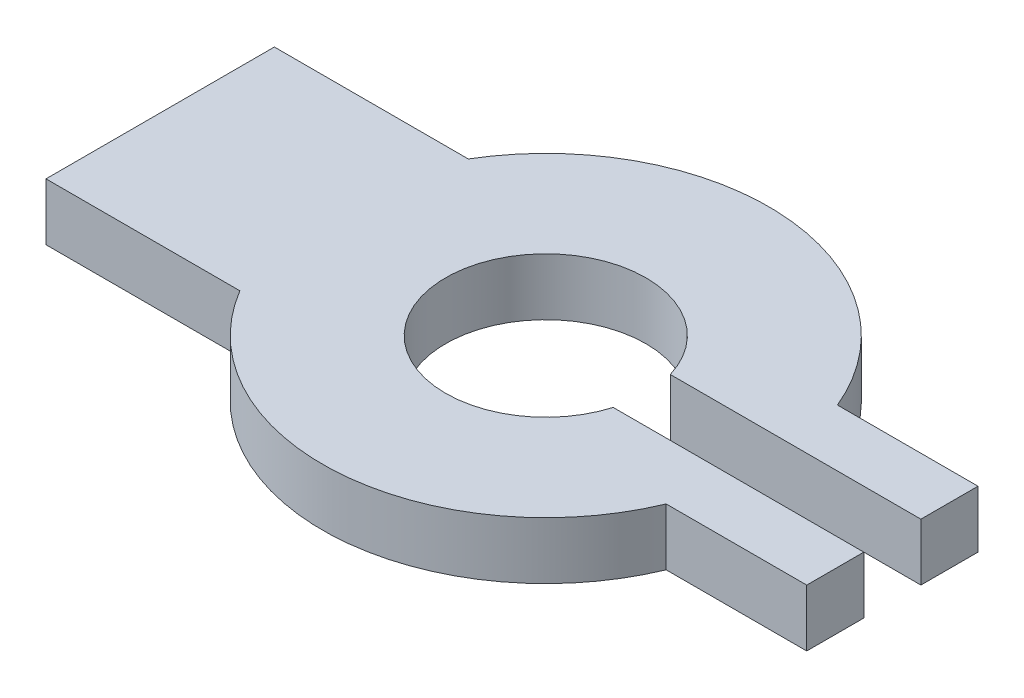
ISO-10303-21;
HEADER;
FILE_DESCRIPTION(('STEP AP214'),'2;1');
FILE_NAME('part.step','',(''),(''),'','','');
FILE_SCHEMA(('AUTOMOTIVE_DESIGN { 1 0 10303 214 1 1 1 1 }'));
ENDSEC;
DATA;
#1=APPLICATION_CONTEXT('core data for automotive mechanical design processes');
#2=APPLICATION_PROTOCOL_DEFINITION('international standard','automotive_design',2000,#1);
#3=PRODUCT_CONTEXT('',#1,'mechanical');
#4=PRODUCT('Part','Part','',(#3));
#5=PRODUCT_RELATED_PRODUCT_CATEGORY('part','',(#4));
#6=PRODUCT_DEFINITION_FORMATION('','',#4);
#7=PRODUCT_DEFINITION_CONTEXT('part definition',#1,'design');
#8=PRODUCT_DEFINITION('design','',#6,#7);
#9=PRODUCT_DEFINITION_SHAPE('','',#8);
#10=(LENGTH_UNIT() NAMED_UNIT(*) SI_UNIT(.MILLI.,.METRE.));
#11=(NAMED_UNIT(*) PLANE_ANGLE_UNIT() SI_UNIT($,.RADIAN.));
#12=(NAMED_UNIT(*) SI_UNIT($,.STERADIAN.) SOLID_ANGLE_UNIT());
#13=UNCERTAINTY_MEASURE_WITH_UNIT(LENGTH_MEASURE(1.E-05),#10,'distance_accuracy_value','');
#14=(GEOMETRIC_REPRESENTATION_CONTEXT(3) GLOBAL_UNCERTAINTY_ASSIGNED_CONTEXT((#13)) GLOBAL_UNIT_ASSIGNED_CONTEXT((#10,
#11,#12)) REPRESENTATION_CONTEXT('',''));
#15=CARTESIAN_POINT('',(0.,0.,0.));
#16=DIRECTION('',(0.,0.,1.));
#17=DIRECTION('',(1.,0.,0.));
#18=AXIS2_PLACEMENT_3D('',#15,#16,#17);
#19=CARTESIAN_POINT('',(3.39995645364333,6.35,0.123181714612702));
#20=DIRECTION('',(0.,-1.,0.));
#21=DIRECTION('',(0.,0.,-1.));
#22=AXIS2_PLACEMENT_3D('',#19,#20,#21);
#23=CYLINDRICAL_SURFACE('',#22,11.1379);
#24=CARTESIAN_POINT('',(3.39995645364333,0.,0.123181714612702));
#25=DIRECTION('',(0.,-1.,0.));
#26=DIRECTION('',(0.,0.,1.));
#27=AXIS2_PLACEMENT_3D('',#24,#25,#26);
#28=CIRCLE('',#27,11.1379);
#29=CARTESIAN_POINT('',(14.0757323697067,0.,3.29818171461271));
#30=VERTEX_POINT('',#29);
#31=CARTESIAN_POINT('',(14.0757323697067,0.,-3.05181828538732));
#32=VERTEX_POINT('',#31);
#33=EDGE_CURVE('E152',#30,#32,#28,.T.);
#34=ORIENTED_EDGE('',*,*,#33,.T.);
#35=DIRECTION('',(0.,-1.,0.));
#36=VECTOR('',#35,1.);
#37=CARTESIAN_POINT('',(14.0757323697067,6.35,-3.05181828538732));
#38=LINE('',#37,#36);
#39=CARTESIAN_POINT('',(14.0757323697067,6.35,-3.05181828538732));
#40=VERTEX_POINT('',#39);
#41=EDGE_CURVE('E11',#40,#32,#38,.T.);
#42=ORIENTED_EDGE('',*,*,#41,.F.);
#43=CARTESIAN_POINT('',(3.39995645364333,6.35,0.123181714612702));
#44=DIRECTION('',(0.,-1.,0.));
#45=DIRECTION('',(0.,0.,1.));
#46=AXIS2_PLACEMENT_3D('',#43,#44,#45);
#47=CIRCLE('',#46,11.1379);
#48=CARTESIAN_POINT('',(14.0757323697067,6.35,3.29818171461271));
#49=VERTEX_POINT('',#48);
#50=EDGE_CURVE('E176',#49,#40,#47,.T.);
#51=ORIENTED_EDGE('',*,*,#50,.F.);
#52=DIRECTION('',(0.,-1.,0.));
#53=VECTOR('',#52,1.);
#54=CARTESIAN_POINT('',(14.0757323697067,6.35,3.29818171461271));
#55=LINE('',#54,#53);
#56=EDGE_CURVE('E148',#49,#30,#55,.T.);
#57=ORIENTED_EDGE('',*,*,#56,.T.);
#58=EDGE_LOOP('',(#34,#42,#51,#57));
#59=FACE_BOUND('',#58,.T.);
#60=ADVANCED_FACE('F32',(#59),#23,.F.);
#61=CARTESIAN_POINT('',(14.0757323697067,6.35,-3.05181828538732));
#62=DIRECTION('',(0.,0.,-1.));
#63=DIRECTION('',(-1.,0.,0.));
#64=AXIS2_PLACEMENT_3D('',#61,#62,#63);
#65=PLANE('',#64);
#66=DIRECTION('',(1.,0.,0.));
#67=VECTOR('',#66,1.);
#68=CARTESIAN_POINT('',(14.0757323697067,0.,-3.05181828538732));
#69=LINE('',#68,#67);
#70=CARTESIAN_POINT('',(41.9515778386119,0.,-3.05181828538731));
#71=VERTEX_POINT('',#70);
#72=EDGE_CURVE('E155',#32,#71,#69,.T.);
#73=ORIENTED_EDGE('',*,*,#72,.T.);
#74=DIRECTION('',(0.,-1.,0.));
#75=VECTOR('',#74,1.);
#76=CARTESIAN_POINT('',(41.9515778386119,6.35,-3.05181828538731));
#77=LINE('',#76,#75);
#78=CARTESIAN_POINT('',(41.9515778386119,6.35,-3.05181828538731));
#79=VERTEX_POINT('',#78);
#80=EDGE_CURVE('E40',#79,#71,#77,.T.);
#81=ORIENTED_EDGE('',*,*,#80,.F.);
#82=DIRECTION('',(1.,0.,0.));
#83=VECTOR('',#82,1.);
#84=CARTESIAN_POINT('',(14.0757323697067,6.35,-3.05181828538732));
#85=LINE('',#84,#83);
#86=EDGE_CURVE('E103',#40,#79,#85,.T.);
#87=ORIENTED_EDGE('',*,*,#86,.F.);
#88=ORIENTED_EDGE('',*,*,#41,.T.);
#89=EDGE_LOOP('',(#73,#81,#87,#88));
#90=FACE_BOUND('',#89,.T.);
#91=ADVANCED_FACE('F252',(#90),#65,.F.);
#92=CARTESIAN_POINT('',(41.9515778386119,6.35,-3.05181828538731));
#93=DIRECTION('',(-1.,0.,0.));
#94=DIRECTION('',(0.,0.,1.));
#95=AXIS2_PLACEMENT_3D('',#92,#93,#94);
#96=PLANE('',#95);
#97=DIRECTION('',(0.,0.,-1.));
#98=VECTOR('',#97,1.);
#99=CARTESIAN_POINT('',(41.9515778386119,0.,-3.05181828538731));
#100=LINE('',#99,#98);
#101=CARTESIAN_POINT('',(41.9515778386119,0.,-9.4018182853873));
#102=VERTEX_POINT('',#101);
#103=EDGE_CURVE('E157',#71,#102,#100,.T.);
#104=ORIENTED_EDGE('',*,*,#103,.T.);
#105=DIRECTION('',(0.,-1.,0.));
#106=VECTOR('',#105,1.);
#107=CARTESIAN_POINT('',(41.9515778386119,6.35,-9.4018182853873));
#108=LINE('',#107,#106);
#109=CARTESIAN_POINT('',(41.9515778386119,6.35,-9.4018182853873));
#110=VERTEX_POINT('',#109);
#111=EDGE_CURVE('E195',#110,#102,#108,.T.);
#112=ORIENTED_EDGE('',*,*,#111,.F.);
#113=DIRECTION('',(0.,0.,-1.));
#114=VECTOR('',#113,1.);
#115=CARTESIAN_POINT('',(41.9515778386119,6.35,-3.05181828538731));
#116=LINE('',#115,#114);
#117=EDGE_CURVE('E203',#79,#110,#116,.T.);
#118=ORIENTED_EDGE('',*,*,#117,.F.);
#119=ORIENTED_EDGE('',*,*,#80,.T.);
#120=EDGE_LOOP('',(#104,#112,#118,#119));
#121=FACE_BOUND('',#120,.T.);
#122=ADVANCED_FACE('F201',(#121),#96,.F.);
#123=CARTESIAN_POINT('',(41.9515778386119,6.35,-9.4018182853873));
#124=DIRECTION('',(0.,0.,1.));
#125=DIRECTION('',(1.,0.,0.));
#126=AXIS2_PLACEMENT_3D('',#123,#124,#125);
#127=PLANE('',#126);
#128=DIRECTION('',(-1.,0.,0.));
#129=VECTOR('',#128,1.);
#130=CARTESIAN_POINT('',(41.9515778386119,0.,-9.4018182853873));
#131=LINE('',#130,#129);
#132=CARTESIAN_POINT('',(26.3169623937396,0.,-9.4018182853873));
#133=VERTEX_POINT('',#132);
#134=EDGE_CURVE('E159',#102,#133,#131,.T.);
#135=ORIENTED_EDGE('',*,*,#134,.T.);
#136=DIRECTION('',(0.,-1.,0.));
#137=VECTOR('',#136,1.);
#138=CARTESIAN_POINT('',(26.3169623937396,6.35,-9.4018182853873));
#139=LINE('',#138,#137);
#140=CARTESIAN_POINT('',(26.3169623937396,6.35,-9.4018182853873));
#141=VERTEX_POINT('',#140);
#142=EDGE_CURVE('E192',#141,#133,#139,.T.);
#143=ORIENTED_EDGE('',*,*,#142,.F.);
#144=DIRECTION('',(-1.,0.,0.));
#145=VECTOR('',#144,1.);
#146=CARTESIAN_POINT('',(41.9515778386119,6.35,-9.4018182853873));
#147=LINE('',#146,#145);
#148=EDGE_CURVE('E220',#110,#141,#147,.T.);
#149=ORIENTED_EDGE('',*,*,#148,.F.);
#150=ORIENTED_EDGE('',*,*,#111,.T.);
#151=EDGE_LOOP('',(#135,#143,#149,#150));
#152=FACE_BOUND('',#151,.T.);
#153=ADVANCED_FACE('F211',(#152),#127,.F.);
#154=CARTESIAN_POINT('',(3.39995645364333,6.35,0.123181714612702));
#155=DIRECTION('',(0.,-1.,0.));
#156=DIRECTION('',(0.,0.,-1.));
#157=AXIS2_PLACEMENT_3D('',#154,#155,#156);
#158=CYLINDRICAL_SURFACE('',#157,24.8176305528632);
#159=CARTESIAN_POINT('',(3.39995645364333,0.,0.123181714612702));
#160=DIRECTION('',(0.,1.,0.));
#161=DIRECTION('',(0.,0.,1.));
#162=AXIS2_PLACEMENT_3D('',#159,#160,#161);
#163=CIRCLE('',#162,24.8176305528632);
#164=CARTESIAN_POINT('',(-17.9219755943305,0.,-12.5768182853873));
#165=VERTEX_POINT('',#164);
#166=EDGE_CURVE('E161',#133,#165,#163,.T.);
#167=ORIENTED_EDGE('',*,*,#166,.T.);
#168=DIRECTION('',(0.,-1.,0.));
#169=VECTOR('',#168,1.);
#170=CARTESIAN_POINT('',(-17.9219755943305,6.35,-12.5768182853873));
#171=LINE('',#170,#169);
#172=CARTESIAN_POINT('',(-17.9219755943305,6.35,-12.5768182853873));
#173=VERTEX_POINT('',#172);
#174=EDGE_CURVE('E189',#173,#165,#171,.T.);
#175=ORIENTED_EDGE('',*,*,#174,.F.);
#176=CARTESIAN_POINT('',(3.39995645364333,6.35,0.123181714612702));
#177=DIRECTION('',(0.,1.,0.));
#178=DIRECTION('',(0.,0.,1.));
#179=AXIS2_PLACEMENT_3D('',#176,#177,#178);
#180=CIRCLE('',#179,24.8176305528632);
#181=EDGE_CURVE('E217',#141,#173,#180,.T.);
#182=ORIENTED_EDGE('',*,*,#181,.F.);
#183=ORIENTED_EDGE('',*,*,#142,.T.);
#184=EDGE_LOOP('',(#167,#175,#182,#183));
#185=FACE_BOUND('',#184,.T.);
#186=ADVANCED_FACE('F215',(#185),#158,.T.);
#187=CARTESIAN_POINT('',(-33.1379435463564,6.35,-12.5768182853873));
#188=DIRECTION('',(0.,0.,1.));
#189=DIRECTION('',(1.,0.,0.));
#190=AXIS2_PLACEMENT_3D('',#187,#188,#189);
#191=PLANE('',#190);
#192=DIRECTION('',(-1.,0.,0.));
#193=VECTOR('',#192,1.);
#194=CARTESIAN_POINT('',(-33.1379435463564,0.,-12.5768182853873));
#195=LINE('',#194,#193);
#196=CARTESIAN_POINT('',(-39.4879435463562,0.,-12.5768182853873));
#197=VERTEX_POINT('',#196);
#198=EDGE_CURVE('E164',#165,#197,#195,.T.);
#199=ORIENTED_EDGE('',*,*,#198,.T.);
#200=DIRECTION('',(0.,-1.,0.));
#201=VECTOR('',#200,1.);
#202=CARTESIAN_POINT('',(-39.4879435463562,6.35,-12.5768182853873));
#203=LINE('',#202,#201);
#204=CARTESIAN_POINT('',(-39.4879435463562,6.35,-12.5768182853873));
#205=VERTEX_POINT('',#204);
#206=EDGE_CURVE('E186',#205,#197,#203,.T.);
#207=ORIENTED_EDGE('',*,*,#206,.F.);
#208=DIRECTION('',(-1.,0.,0.));
#209=VECTOR('',#208,1.);
#210=CARTESIAN_POINT('',(-33.1379435463564,6.35,-12.5768182853873));
#211=LINE('',#210,#209);
#212=EDGE_CURVE('E219',#173,#205,#211,.T.);
#213=ORIENTED_EDGE('',*,*,#212,.F.);
#214=ORIENTED_EDGE('',*,*,#174,.T.);
#215=EDGE_LOOP('',(#199,#207,#213,#214));
#216=FACE_BOUND('',#215,.T.);
#217=ADVANCED_FACE('F265',(#216),#191,.F.);
#218=CARTESIAN_POINT('',(-39.4879435463562,6.35,-12.5768182853873));
#219=DIRECTION('',(1.,0.,0.));
#220=DIRECTION('',(0.,0.,-1.));
#221=AXIS2_PLACEMENT_3D('',#218,#219,#220);
#222=PLANE('',#221);
#223=DIRECTION('',(0.,0.,1.));
#224=VECTOR('',#223,1.);
#225=CARTESIAN_POINT('',(-39.4879435463562,0.,-12.5768182853873));
#226=LINE('',#225,#224);
#227=CARTESIAN_POINT('',(-39.4879435463562,0.,12.8231817146127));
#228=VERTEX_POINT('',#227);
#229=EDGE_CURVE('E166',#197,#228,#226,.T.);
#230=ORIENTED_EDGE('',*,*,#229,.T.);
#231=DIRECTION('',(0.,-1.,0.));
#232=VECTOR('',#231,1.);
#233=CARTESIAN_POINT('',(-39.4879435463562,6.35,12.8231817146127));
#234=LINE('',#233,#232);
#235=CARTESIAN_POINT('',(-39.4879435463562,6.35,12.8231817146127));
#236=VERTEX_POINT('',#235);
#237=EDGE_CURVE('E183',#236,#228,#234,.T.);
#238=ORIENTED_EDGE('',*,*,#237,.F.);
#239=DIRECTION('',(0.,0.,1.));
#240=VECTOR('',#239,1.);
#241=CARTESIAN_POINT('',(-39.4879435463562,6.35,-12.5768182853873));
#242=LINE('',#241,#240);
#243=EDGE_CURVE('E222',#205,#236,#242,.T.);
#244=ORIENTED_EDGE('',*,*,#243,.F.);
#245=ORIENTED_EDGE('',*,*,#206,.T.);
#246=EDGE_LOOP('',(#230,#238,#244,#245));
#247=FACE_BOUND('',#246,.T.);
#248=ADVANCED_FACE('F268',(#247),#222,.F.);
#249=CARTESIAN_POINT('',(-33.1379435463564,6.35,12.8231817146127));
#250=DIRECTION('',(0.,0.,-1.));
#251=DIRECTION('',(-1.,0.,0.));
#252=AXIS2_PLACEMENT_3D('',#249,#250,#251);
#253=PLANE('',#252);
#254=DIRECTION('',(1.,0.,0.));
#255=VECTOR('',#254,1.);
#256=CARTESIAN_POINT('',(-33.1379435463564,0.,12.8231817146127));
#257=LINE('',#256,#255);
#258=CARTESIAN_POINT('',(-17.9219755943305,0.,12.8231817146127));
#259=VERTEX_POINT('',#258);
#260=EDGE_CURVE('E169',#228,#259,#257,.T.);
#261=ORIENTED_EDGE('',*,*,#260,.T.);
#262=DIRECTION('',(0.,-1.,0.));
#263=VECTOR('',#262,1.);
#264=CARTESIAN_POINT('',(-17.9219755943305,6.35,12.8231817146127));
#265=LINE('',#264,#263);
#266=CARTESIAN_POINT('',(-17.9219755943305,6.35,12.8231817146127));
#267=VERTEX_POINT('',#266);
#268=EDGE_CURVE('E180',#267,#259,#265,.T.);
#269=ORIENTED_EDGE('',*,*,#268,.F.);
#270=DIRECTION('',(1.,0.,0.));
#271=VECTOR('',#270,1.);
#272=CARTESIAN_POINT('',(-39.4879435463562,6.35,12.8231817146127));
#273=LINE('',#272,#271);
#274=EDGE_CURVE('E228',#236,#267,#273,.T.);
#275=ORIENTED_EDGE('',*,*,#274,.F.);
#276=ORIENTED_EDGE('',*,*,#237,.T.);
#277=EDGE_LOOP('',(#261,#269,#275,#276));
#278=FACE_BOUND('',#277,.T.);
#279=ADVANCED_FACE('F234',(#278),#253,.F.);
#280=CARTESIAN_POINT('',(3.39995645364333,6.35,0.123181714612702));
#281=DIRECTION('',(0.,-1.,0.));
#282=DIRECTION('',(0.,0.,-1.));
#283=AXIS2_PLACEMENT_3D('',#280,#281,#282);
#284=CYLINDRICAL_SURFACE('',#283,24.8176305528632);
#285=CARTESIAN_POINT('',(3.39995645364333,0.,0.123181714612702));
#286=DIRECTION('',(0.,1.,0.));
#287=DIRECTION('',(0.,0.,1.));
#288=AXIS2_PLACEMENT_3D('',#285,#286,#287);
#289=CIRCLE('',#288,24.8176305528632);
#290=CARTESIAN_POINT('',(26.3169623937397,0.,9.64818171461275));
#291=VERTEX_POINT('',#290);
#292=EDGE_CURVE('E171',#259,#291,#289,.T.);
#293=ORIENTED_EDGE('',*,*,#292,.T.);
#294=DIRECTION('',(0.,-1.,0.));
#295=VECTOR('',#294,1.);
#296=CARTESIAN_POINT('',(26.3169623937397,6.35,9.64818171461275));
#297=LINE('',#296,#295);
#298=CARTESIAN_POINT('',(26.3169623937397,6.35,9.64818171461275));
#299=VERTEX_POINT('',#298);
#300=EDGE_CURVE('E143',#299,#291,#297,.T.);
#301=ORIENTED_EDGE('',*,*,#300,.F.);
#302=CARTESIAN_POINT('',(3.39995645364333,6.35,0.123181714612702));
#303=DIRECTION('',(0.,1.,0.));
#304=DIRECTION('',(0.,0.,1.));
#305=AXIS2_PLACEMENT_3D('',#302,#303,#304);
#306=CIRCLE('',#305,24.8176305528632);
#307=EDGE_CURVE('E134',#267,#299,#306,.T.);
#308=ORIENTED_EDGE('',*,*,#307,.F.);
#309=ORIENTED_EDGE('',*,*,#268,.T.);
#310=EDGE_LOOP('',(#293,#301,#308,#309));
#311=FACE_BOUND('',#310,.T.);
#312=ADVANCED_FACE('F237',(#311),#284,.T.);
#313=CARTESIAN_POINT('',(41.9515778386119,6.35,9.64818171461269));
#314=DIRECTION('',(0.,0.,-1.));
#315=DIRECTION('',(-1.,0.,0.));
#316=AXIS2_PLACEMENT_3D('',#313,#314,#315);
#317=PLANE('',#316);
#318=DIRECTION('',(1.,0.,0.));
#319=VECTOR('',#318,1.);
#320=CARTESIAN_POINT('',(41.9515778386119,0.,9.64818171461269));
#321=LINE('',#320,#319);
#322=CARTESIAN_POINT('',(41.9515778386119,0.,9.64818171461269));
#323=VERTEX_POINT('',#322);
#324=EDGE_CURVE('E142',#291,#323,#321,.T.);
#325=ORIENTED_EDGE('',*,*,#324,.T.);
#326=DIRECTION('',(0.,-1.,0.));
#327=VECTOR('',#326,1.);
#328=CARTESIAN_POINT('',(41.9515778386119,6.35,9.64818171461269));
#329=LINE('',#328,#327);
#330=CARTESIAN_POINT('',(41.9515778386119,6.35,9.64818171461269));
#331=VERTEX_POINT('',#330);
#332=EDGE_CURVE('E139',#331,#323,#329,.T.);
#333=ORIENTED_EDGE('',*,*,#332,.F.);
#334=DIRECTION('',(1.,0.,0.));
#335=VECTOR('',#334,1.);
#336=CARTESIAN_POINT('',(41.9515778386119,6.35,9.64818171461269));
#337=LINE('',#336,#335);
#338=EDGE_CURVE('E128',#299,#331,#337,.T.);
#339=ORIENTED_EDGE('',*,*,#338,.F.);
#340=ORIENTED_EDGE('',*,*,#300,.T.);
#341=EDGE_LOOP('',(#325,#333,#339,#340));
#342=FACE_BOUND('',#341,.T.);
#343=ADVANCED_FACE('F140',(#342),#317,.F.);
#344=CARTESIAN_POINT('',(41.9515778386119,6.35,3.2981817146127));
#345=DIRECTION('',(-1.,0.,0.));
#346=DIRECTION('',(0.,0.,1.));
#347=AXIS2_PLACEMENT_3D('',#344,#345,#346);
#348=PLANE('',#347);
#349=DIRECTION('',(0.,0.,-1.));
#350=VECTOR('',#349,1.);
#351=CARTESIAN_POINT('',(41.9515778386119,0.,3.2981817146127));
#352=LINE('',#351,#350);
#353=CARTESIAN_POINT('',(41.9515778386119,0.,3.2981817146127));
#354=VERTEX_POINT('',#353);
#355=EDGE_CURVE('E89',#323,#354,#352,.T.);
#356=ORIENTED_EDGE('',*,*,#355,.T.);
#357=DIRECTION('',(0.,-1.,0.));
#358=VECTOR('',#357,1.);
#359=CARTESIAN_POINT('',(41.9515778386119,6.35,3.2981817146127));
#360=LINE('',#359,#358);
#361=CARTESIAN_POINT('',(41.9515778386119,6.35,3.2981817146127));
#362=VERTEX_POINT('',#361);
#363=EDGE_CURVE('E144',#362,#354,#360,.T.);
#364=ORIENTED_EDGE('',*,*,#363,.F.);
#365=DIRECTION('',(0.,0.,-1.));
#366=VECTOR('',#365,1.);
#367=CARTESIAN_POINT('',(41.9515778386119,6.35,3.2981817146127));
#368=LINE('',#367,#366);
#369=EDGE_CURVE('E132',#331,#362,#368,.T.);
#370=ORIENTED_EDGE('',*,*,#369,.F.);
#371=ORIENTED_EDGE('',*,*,#332,.T.);
#372=EDGE_LOOP('',(#356,#364,#370,#371));
#373=FACE_BOUND('',#372,.T.);
#374=ADVANCED_FACE('F146',(#373),#348,.F.);
#375=CARTESIAN_POINT('',(14.0757323697067,6.35,3.29818171461271));
#376=DIRECTION('',(0.,0.,1.));
#377=DIRECTION('',(1.,0.,0.));
#378=AXIS2_PLACEMENT_3D('',#375,#376,#377);
#379=PLANE('',#378);
#380=DIRECTION('',(-1.,0.,0.));
#381=VECTOR('',#380,1.);
#382=CARTESIAN_POINT('',(14.0757323697067,0.,3.29818171461271));
#383=LINE('',#382,#381);
#384=EDGE_CURVE('E95',#354,#30,#383,.T.);
#385=ORIENTED_EDGE('',*,*,#384,.T.);
#386=ORIENTED_EDGE('',*,*,#56,.F.);
#387=DIRECTION('',(-1.,0.,0.));
#388=VECTOR('',#387,1.);
#389=CARTESIAN_POINT('',(14.0757323697067,6.35,3.29818171461271));
#390=LINE('',#389,#388);
#391=EDGE_CURVE('E48',#362,#49,#390,.T.);
#392=ORIENTED_EDGE('',*,*,#391,.F.);
#393=ORIENTED_EDGE('',*,*,#363,.T.);
#394=EDGE_LOOP('',(#385,#386,#392,#393));
#395=FACE_BOUND('',#394,.T.);
#396=ADVANCED_FACE('F241',(#395),#379,.F.);
#397=CARTESIAN_POINT('',(3.39995645364333,6.35,0.123181714612702));
#398=DIRECTION('',(0.,1.,0.));
#399=DIRECTION('',(0.,0.,1.));
#400=AXIS2_PLACEMENT_3D('',#397,#398,#399);
#401=PLANE('',#400);
#402=ORIENTED_EDGE('',*,*,#50,.T.);
#403=ORIENTED_EDGE('',*,*,#86,.T.);
#404=ORIENTED_EDGE('',*,*,#117,.T.);
#405=ORIENTED_EDGE('',*,*,#148,.T.);
#406=ORIENTED_EDGE('',*,*,#181,.T.);
#407=ORIENTED_EDGE('',*,*,#212,.T.);
#408=ORIENTED_EDGE('',*,*,#243,.T.);
#409=ORIENTED_EDGE('',*,*,#274,.T.);
#410=ORIENTED_EDGE('',*,*,#307,.T.);
#411=ORIENTED_EDGE('',*,*,#338,.T.);
#412=ORIENTED_EDGE('',*,*,#369,.T.);
#413=ORIENTED_EDGE('',*,*,#391,.T.);
#414=EDGE_LOOP('',(#402,#403,#404,#405,#406,#407,#408,#409,#410,#411,#412,#413));
#415=FACE_BOUND('',#414,.T.);
#416=ADVANCED_FACE('F130',(#415),#401,.T.);
#417=CARTESIAN_POINT('',(3.39995645364333,0.,0.123181714612702));
#418=DIRECTION('',(0.,1.,0.));
#419=DIRECTION('',(0.,0.,1.));
#420=AXIS2_PLACEMENT_3D('',#417,#418,#419);
#421=PLANE('',#420);
#422=ORIENTED_EDGE('',*,*,#33,.F.);
#423=ORIENTED_EDGE('',*,*,#384,.F.);
#424=ORIENTED_EDGE('',*,*,#355,.F.);
#425=ORIENTED_EDGE('',*,*,#324,.F.);
#426=ORIENTED_EDGE('',*,*,#292,.F.);
#427=ORIENTED_EDGE('',*,*,#260,.F.);
#428=ORIENTED_EDGE('',*,*,#229,.F.);
#429=ORIENTED_EDGE('',*,*,#198,.F.);
#430=ORIENTED_EDGE('',*,*,#166,.F.);
#431=ORIENTED_EDGE('',*,*,#134,.F.);
#432=ORIENTED_EDGE('',*,*,#103,.F.);
#433=ORIENTED_EDGE('',*,*,#72,.F.);
#434=EDGE_LOOP('',(#422,#423,#424,#425,#426,#427,#428,#429,#430,#431,#432,#433));
#435=FACE_BOUND('',#434,.T.);
#436=ADVANCED_FACE('F207',(#435),#421,.F.);
#437=CLOSED_SHELL('',(#60,#91,#122,#153,#186,#217,#248,#279,#312,#343,#374,#396,#416,#436));
#438=MANIFOLD_SOLID_BREP('B2',#437);
#439=ADVANCED_BREP_SHAPE_REPRESENTATION('',(#18,#438),#14);
#440=SHAPE_DEFINITION_REPRESENTATION(#9,#439);
ENDSEC;
END-ISO-10303-21;
